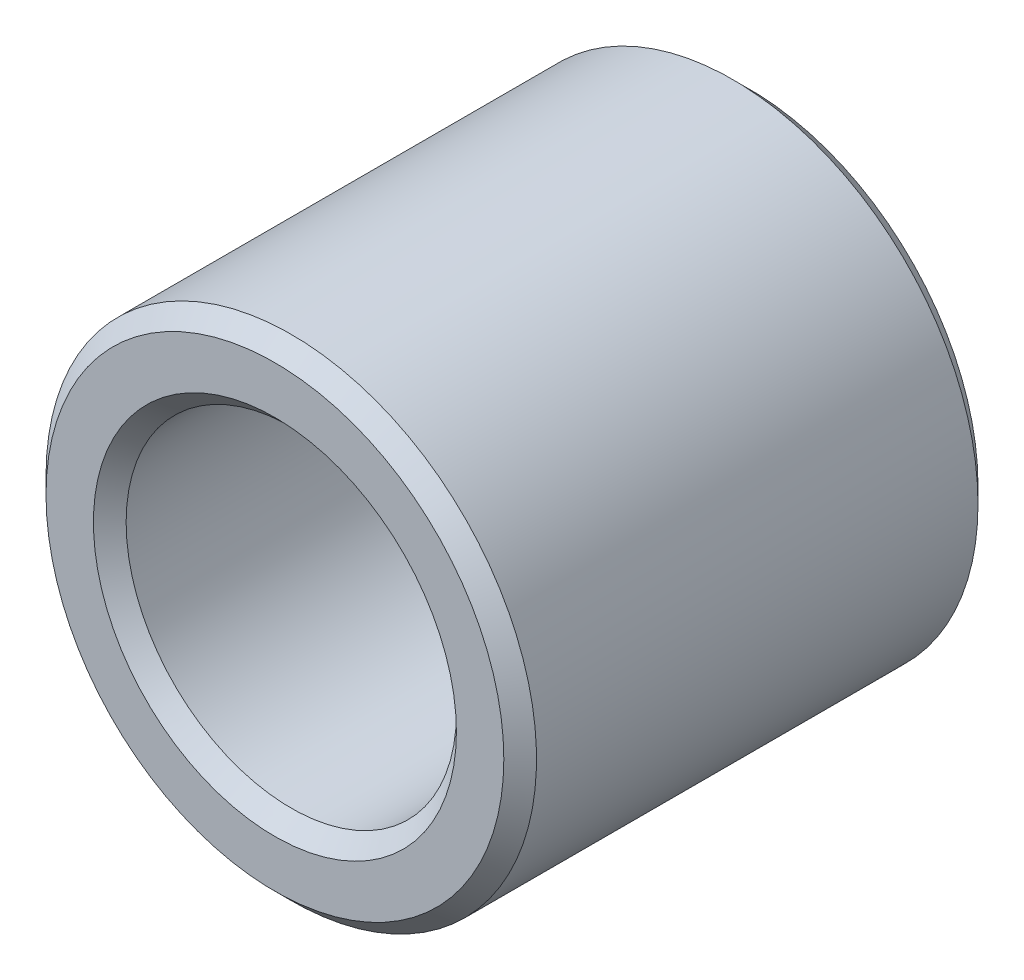
ISO-10303-21;
HEADER;
FILE_DESCRIPTION(('STEP AP214'),'2;1');
FILE_NAME('part.step','',(''),(''),'','','');
FILE_SCHEMA(('AUTOMOTIVE_DESIGN { 1 0 10303 214 1 1 1 1 }'));
ENDSEC;
DATA;
#1=APPLICATION_CONTEXT('core data for automotive mechanical design processes');
#2=APPLICATION_PROTOCOL_DEFINITION('international standard','automotive_design',2000,#1);
#3=PRODUCT_CONTEXT('',#1,'mechanical');
#4=PRODUCT('Part','Part','',(#3));
#5=PRODUCT_RELATED_PRODUCT_CATEGORY('part','',(#4));
#6=PRODUCT_DEFINITION_FORMATION('','',#4);
#7=PRODUCT_DEFINITION_CONTEXT('part definition',#1,'design');
#8=PRODUCT_DEFINITION('design','',#6,#7);
#9=PRODUCT_DEFINITION_SHAPE('','',#8);
#10=(LENGTH_UNIT() NAMED_UNIT(*) SI_UNIT(.MILLI.,.METRE.));
#11=(NAMED_UNIT(*) PLANE_ANGLE_UNIT() SI_UNIT($,.RADIAN.));
#12=(NAMED_UNIT(*) SI_UNIT($,.STERADIAN.) SOLID_ANGLE_UNIT());
#13=UNCERTAINTY_MEASURE_WITH_UNIT(LENGTH_MEASURE(1.E-05),#10,'distance_accuracy_value','');
#14=(GEOMETRIC_REPRESENTATION_CONTEXT(3) GLOBAL_UNCERTAINTY_ASSIGNED_CONTEXT((#13)) GLOBAL_UNIT_ASSIGNED_CONTEXT((#10,
#11,#12)) REPRESENTATION_CONTEXT('',''));
#15=CARTESIAN_POINT('',(0.,0.,0.));
#16=DIRECTION('',(0.,0.,1.));
#17=DIRECTION('',(1.,0.,0.));
#18=AXIS2_PLACEMENT_3D('',#15,#16,#17);
#19=CARTESIAN_POINT('',(0.,0.,7.25));
#20=DIRECTION('',(0.,0.,1.));
#21=DIRECTION('',(1.,0.,0.));
#22=AXIS2_PLACEMENT_3D('',#19,#20,#21);
#23=PLANE('',#22);
#24=CARTESIAN_POINT('',(0.,0.,7.25));
#25=DIRECTION('',(0.,0.,1.));
#26=DIRECTION('',(1.,0.,0.));
#27=AXIS2_PLACEMENT_3D('',#24,#25,#26);
#28=CIRCLE('',#27,5.55000000000001);
#29=CARTESIAN_POINT('',(5.55000000000001,0.,7.25));
#30=VERTEX_POINT('',#29);
#31=EDGE_CURVE('E10',#30,#30,#28,.F.);
#32=ORIENTED_EDGE('',*,*,#31,.T.);
#33=EDGE_LOOP('',(#32));
#34=FACE_BOUND('',#33,.T.);
#35=CARTESIAN_POINT('',(0.,0.,7.25));
#36=DIRECTION('',(0.,0.,1.));
#37=DIRECTION('',(1.,0.,0.));
#38=AXIS2_PLACEMENT_3D('',#35,#36,#37);
#39=CIRCLE('',#38,7.00000000000001);
#40=CARTESIAN_POINT('',(7.00000000000001,0.,7.25));
#41=VERTEX_POINT('',#40);
#42=EDGE_CURVE('E51',#41,#41,#39,.T.);
#43=ORIENTED_EDGE('',*,*,#42,.T.);
#44=EDGE_LOOP('',(#43));
#45=FACE_BOUND('',#44,.T.);
#46=ADVANCED_FACE('F43',(#34,#45),#23,.T.);
#47=CARTESIAN_POINT('',(0.,0.,-7.25));
#48=DIRECTION('',(0.,0.,1.));
#49=DIRECTION('',(1.,0.,0.));
#50=AXIS2_PLACEMENT_3D('',#47,#48,#49);
#51=PLANE('',#50);
#52=CARTESIAN_POINT('',(0.,0.,-7.25));
#53=DIRECTION('',(0.,0.,1.));
#54=DIRECTION('',(1.,0.,0.));
#55=AXIS2_PLACEMENT_3D('',#52,#53,#54);
#56=CIRCLE('',#55,5.54999999999999);
#57=CARTESIAN_POINT('',(5.54999999999999,0.,-7.25));
#58=VERTEX_POINT('',#57);
#59=EDGE_CURVE('E67',#58,#58,#56,.T.);
#60=ORIENTED_EDGE('',*,*,#59,.T.);
#61=EDGE_LOOP('',(#60));
#62=FACE_BOUND('',#61,.T.);
#63=CARTESIAN_POINT('',(0.,0.,-7.25));
#64=DIRECTION('',(0.,0.,1.));
#65=DIRECTION('',(1.,0.,0.));
#66=AXIS2_PLACEMENT_3D('',#63,#64,#65);
#67=CIRCLE('',#66,6.99999999999998);
#68=CARTESIAN_POINT('',(6.99999999999998,0.,-7.25));
#69=VERTEX_POINT('',#68);
#70=EDGE_CURVE('E71',#69,#69,#67,.F.);
#71=ORIENTED_EDGE('',*,*,#70,.T.);
#72=EDGE_LOOP('',(#71));
#73=FACE_BOUND('',#72,.T.);
#74=ADVANCED_FACE('F79',(#62,#73),#51,.F.);
#75=CARTESIAN_POINT('',(0.,0.,7.25));
#76=DIRECTION('',(0.,0.,-1.));
#77=DIRECTION('',(-1.,0.,0.));
#78=AXIS2_PLACEMENT_3D('',#75,#76,#77);
#79=CYLINDRICAL_SURFACE('',#78,7.5);
#80=CARTESIAN_POINT('',(0.,0.,-6.74999999999999));
#81=DIRECTION('',(0.,0.,1.));
#82=DIRECTION('',(1.,0.,0.));
#83=AXIS2_PLACEMENT_3D('',#80,#81,#82);
#84=CIRCLE('',#83,7.5);
#85=CARTESIAN_POINT('',(-7.5,0.,-6.74999999999999));
#86=VERTEX_POINT('',#85);
#87=EDGE_CURVE('E54',#86,#86,#84,.T.);
#88=CARTESIAN_POINT('',(0.,0.,6.75000000000001));
#89=DIRECTION('',(0.,0.,1.));
#90=DIRECTION('',(1.,0.,0.));
#91=AXIS2_PLACEMENT_3D('',#88,#89,#90);
#92=CIRCLE('',#91,7.5);
#93=CARTESIAN_POINT('',(-7.5,0.,6.75000000000001));
#94=VERTEX_POINT('',#93);
#95=EDGE_CURVE('E56',#94,#94,#92,.F.);
#96=CARTESIAN_POINT('',(-7.5,0.,-6.74999999999999));
#97=CARTESIAN_POINT('',(-7.5,0.,-6.60937499999999));
#98=CARTESIAN_POINT('',(-7.5,0.,-6.46874999999999));
#99=CARTESIAN_POINT('',(-7.5,0.,-6.18749999999999));
#100=CARTESIAN_POINT('',(-7.5,0.,-6.04687499999999));
#101=CARTESIAN_POINT('',(-7.5,0.,-5.76562499999999));
#102=CARTESIAN_POINT('',(-7.5,0.,-5.62499999999999));
#103=CARTESIAN_POINT('',(-7.5,0.,-5.34374999999999));
#104=CARTESIAN_POINT('',(-7.5,0.,-5.20312499999999));
#105=CARTESIAN_POINT('',(-7.5,0.,-4.92187499999999));
#106=CARTESIAN_POINT('',(-7.5,0.,-4.78124999999999));
#107=CARTESIAN_POINT('',(-7.5,0.,-4.49999999999999));
#108=CARTESIAN_POINT('',(-7.5,0.,-4.35937499999999));
#109=CARTESIAN_POINT('',(-7.5,0.,-4.07812499999999));
#110=CARTESIAN_POINT('',(-7.5,0.,-3.93749999999999));
#111=CARTESIAN_POINT('',(-7.5,0.,-3.65624999999999));
#112=CARTESIAN_POINT('',(-7.5,0.,-3.51562499999999));
#113=CARTESIAN_POINT('',(-7.5,0.,-3.23437499999999));
#114=CARTESIAN_POINT('',(-7.5,0.,-3.09374999999999));
#115=CARTESIAN_POINT('',(-7.5,0.,-2.81249999999999));
#116=CARTESIAN_POINT('',(-7.5,0.,-2.67187499999999));
#117=CARTESIAN_POINT('',(-7.5,0.,-2.39062499999999));
#118=CARTESIAN_POINT('',(-7.5,0.,-2.24999999999999));
#119=CARTESIAN_POINT('',(-7.5,0.,-1.96874999999999));
#120=CARTESIAN_POINT('',(-7.5,0.,-1.82812499999999));
#121=CARTESIAN_POINT('',(-7.5,0.,-1.54687499999999));
#122=CARTESIAN_POINT('',(-7.5,0.,-1.40624999999999));
#123=CARTESIAN_POINT('',(-7.5,0.,-1.12499999999999));
#124=CARTESIAN_POINT('',(-7.5,0.,-0.984374999999991));
#125=CARTESIAN_POINT('',(-7.5,0.,-0.703124999999991));
#126=CARTESIAN_POINT('',(-7.5,0.,-0.562499999999991));
#127=CARTESIAN_POINT('',(-7.5,0.,-0.281249999999992));
#128=CARTESIAN_POINT('',(-7.5,0.,-0.140624999999991));
#129=CARTESIAN_POINT('',(-7.5,0.,0.140625000000009));
#130=CARTESIAN_POINT('',(-7.5,0.,0.281250000000009));
#131=CARTESIAN_POINT('',(-7.5,0.,0.562500000000009));
#132=CARTESIAN_POINT('',(-7.5,0.,0.703125000000009));
#133=CARTESIAN_POINT('',(-7.5,0.,0.984375000000008));
#134=CARTESIAN_POINT('',(-7.5,0.,1.12500000000001));
#135=CARTESIAN_POINT('',(-7.5,0.,1.40625000000001));
#136=CARTESIAN_POINT('',(-7.5,0.,1.54687500000001));
#137=CARTESIAN_POINT('',(-7.5,0.,1.82812500000001));
#138=CARTESIAN_POINT('',(-7.5,0.,1.96875000000001));
#139=CARTESIAN_POINT('',(-7.5,0.,2.25000000000001));
#140=CARTESIAN_POINT('',(-7.5,0.,2.39062500000001));
#141=CARTESIAN_POINT('',(-7.5,0.,2.67187500000001));
#142=CARTESIAN_POINT('',(-7.5,0.,2.81250000000001));
#143=CARTESIAN_POINT('',(-7.5,0.,3.09375000000001));
#144=CARTESIAN_POINT('',(-7.5,0.,3.23437500000001));
#145=CARTESIAN_POINT('',(-7.5,0.,3.51562500000001));
#146=CARTESIAN_POINT('',(-7.5,0.,3.65625000000001));
#147=CARTESIAN_POINT('',(-7.5,0.,3.93750000000001));
#148=CARTESIAN_POINT('',(-7.5,0.,4.07812500000001));
#149=CARTESIAN_POINT('',(-7.5,0.,4.35937500000001));
#150=CARTESIAN_POINT('',(-7.5,0.,4.50000000000001));
#151=CARTESIAN_POINT('',(-7.5,0.,4.78125000000001));
#152=CARTESIAN_POINT('',(-7.5,0.,4.92187500000001));
#153=CARTESIAN_POINT('',(-7.5,0.,5.20312500000001));
#154=CARTESIAN_POINT('',(-7.5,0.,5.34375000000001));
#155=CARTESIAN_POINT('',(-7.5,0.,5.62500000000001));
#156=CARTESIAN_POINT('',(-7.5,0.,5.76562500000001));
#157=CARTESIAN_POINT('',(-7.5,0.,6.04687500000001));
#158=CARTESIAN_POINT('',(-7.5,0.,6.18750000000001));
#159=CARTESIAN_POINT('',(-7.5,0.,6.46875000000001));
#160=CARTESIAN_POINT('',(-7.5,0.,6.60937500000001));
#161=CARTESIAN_POINT('',(-7.5,0.,6.75000000000001));
#162=B_SPLINE_CURVE_WITH_KNOTS('',3,(#96,#97,#98,#99,#100,#101,#102,#103,#104,#105,#106,#107,
#108,#109,#110,#111,#112,#113,#114,#115,#116,#117,#118,#119,#120,#121,#122,#123,#124,#125,#126,
#127,#128,#129,#130,#131,#132,#133,#134,#135,#136,#137,#138,#139,#140,#141,#142,#143,#144,#145,
#146,#147,#148,#149,#150,#151,#152,#153,#154,#155,#156,#157,#158,#159,#160,#161),.UNSPECIFIED.,
.F.,.F.,(4,2,2,2,2,2,2,2,2,2,2,2,2,2,2,2,2,2,2,2,2,2,2,2,2,2,2,2,2,2,2,2,4),(0.,0.421875,
0.843750000000001,1.265625,1.6875,2.109375,2.53125,2.953125,3.375,3.796875,4.21875,4.640625,
5.0625,5.484375,5.90625,6.328125,6.75,7.171875,7.59375,8.015625,8.4375,8.859375,9.28125,
9.703125,10.125,10.546875,10.96875,11.390625,11.8125,12.234375,12.65625,13.078125,13.5),.UNSPECIFIED.);
#163=EDGE_CURVE('BSEAM87',#86,#94,#162,.T.);
#164=ORIENTED_EDGE('',*,*,#87,.T.);
#165=ORIENTED_EDGE('',*,*,#95,.T.);
#166=ORIENTED_EDGE('',*,*,#163,.T.);
#167=ORIENTED_EDGE('',*,*,#163,.F.);
#168=EDGE_LOOP('',(#164,#166,#165,#167));
#169=FACE_BOUND('',#168,.T.);
#170=ADVANCED_FACE('F87',(#169),#79,.T.);
#171=CARTESIAN_POINT('',(0.,0.,7.25));
#172=DIRECTION('',(0.,0.,-1.));
#173=DIRECTION('',(-1.,0.,0.));
#174=AXIS2_PLACEMENT_3D('',#171,#172,#173);
#175=CYLINDRICAL_SURFACE('',#174,5.05);
#176=CARTESIAN_POINT('',(0.,0.,-6.75000000000001));
#177=DIRECTION('',(0.,0.,1.));
#178=DIRECTION('',(1.,0.,0.));
#179=AXIS2_PLACEMENT_3D('',#176,#177,#178);
#180=CIRCLE('',#179,5.05);
#181=CARTESIAN_POINT('',(-5.05,0.,-6.75000000000001));
#182=VERTEX_POINT('',#181);
#183=EDGE_CURVE('E65',#182,#182,#180,.F.);
#184=CARTESIAN_POINT('',(0.,0.,6.74999999999999));
#185=DIRECTION('',(0.,0.,1.));
#186=DIRECTION('',(1.,0.,0.));
#187=AXIS2_PLACEMENT_3D('',#184,#185,#186);
#188=CIRCLE('',#187,5.05);
#189=CARTESIAN_POINT('',(-5.05,0.,6.74999999999999));
#190=VERTEX_POINT('',#189);
#191=EDGE_CURVE('E70',#190,#190,#188,.T.);
#192=CARTESIAN_POINT('',(-5.05,0.,-6.75000000000001));
#193=CARTESIAN_POINT('',(-5.05,0.,-6.60937500000001));
#194=CARTESIAN_POINT('',(-5.05,0.,-6.46875000000001));
#195=CARTESIAN_POINT('',(-5.05,0.,-6.18750000000001));
#196=CARTESIAN_POINT('',(-5.05,0.,-6.04687500000001));
#197=CARTESIAN_POINT('',(-5.05,0.,-5.76562500000001));
#198=CARTESIAN_POINT('',(-5.05,0.,-5.62500000000001));
#199=CARTESIAN_POINT('',(-5.05,0.,-5.34375000000001));
#200=CARTESIAN_POINT('',(-5.05,0.,-5.20312500000001));
#201=CARTESIAN_POINT('',(-5.05,0.,-4.92187500000001));
#202=CARTESIAN_POINT('',(-5.05,0.,-4.78125000000001));
#203=CARTESIAN_POINT('',(-5.05,0.,-4.50000000000001));
#204=CARTESIAN_POINT('',(-5.05,0.,-4.35937500000001));
#205=CARTESIAN_POINT('',(-5.05,0.,-4.07812500000001));
#206=CARTESIAN_POINT('',(-5.05,0.,-3.93750000000001));
#207=CARTESIAN_POINT('',(-5.05,0.,-3.65625000000001));
#208=CARTESIAN_POINT('',(-5.05,0.,-3.51562500000001));
#209=CARTESIAN_POINT('',(-5.05,0.,-3.23437500000001));
#210=CARTESIAN_POINT('',(-5.05,0.,-3.09375000000001));
#211=CARTESIAN_POINT('',(-5.05,0.,-2.81250000000001));
#212=CARTESIAN_POINT('',(-5.05,0.,-2.67187500000001));
#213=CARTESIAN_POINT('',(-5.05,0.,-2.39062500000001));
#214=CARTESIAN_POINT('',(-5.05,0.,-2.25000000000001));
#215=CARTESIAN_POINT('',(-5.05,0.,-1.96875000000001));
#216=CARTESIAN_POINT('',(-5.05,0.,-1.82812500000001));
#217=CARTESIAN_POINT('',(-5.05,0.,-1.54687500000001));
#218=CARTESIAN_POINT('',(-5.05,0.,-1.40625000000001));
#219=CARTESIAN_POINT('',(-5.05,0.,-1.12500000000001));
#220=CARTESIAN_POINT('',(-5.05,0.,-0.984375000000007));
#221=CARTESIAN_POINT('',(-5.05,0.,-0.703125000000007));
#222=CARTESIAN_POINT('',(-5.05,0.,-0.562500000000008));
#223=CARTESIAN_POINT('',(-5.05,0.,-0.281250000000008));
#224=CARTESIAN_POINT('',(-5.05,0.,-0.140625000000008));
#225=CARTESIAN_POINT('',(-5.05,0.,0.140624999999992));
#226=CARTESIAN_POINT('',(-5.05,0.,0.281249999999992));
#227=CARTESIAN_POINT('',(-5.05,0.,0.562499999999992));
#228=CARTESIAN_POINT('',(-5.05,0.,0.703124999999992));
#229=CARTESIAN_POINT('',(-5.05,0.,0.984374999999992));
#230=CARTESIAN_POINT('',(-5.05,0.,1.12499999999999));
#231=CARTESIAN_POINT('',(-5.05,0.,1.40624999999999));
#232=CARTESIAN_POINT('',(-5.05,0.,1.54687499999999));
#233=CARTESIAN_POINT('',(-5.05,0.,1.82812499999999));
#234=CARTESIAN_POINT('',(-5.05,0.,1.96874999999999));
#235=CARTESIAN_POINT('',(-5.05,0.,2.24999999999999));
#236=CARTESIAN_POINT('',(-5.05,0.,2.39062499999999));
#237=CARTESIAN_POINT('',(-5.05,0.,2.67187499999999));
#238=CARTESIAN_POINT('',(-5.05,0.,2.81249999999999));
#239=CARTESIAN_POINT('',(-5.05,0.,3.09374999999999));
#240=CARTESIAN_POINT('',(-5.05,0.,3.23437499999999));
#241=CARTESIAN_POINT('',(-5.05,0.,3.51562499999999));
#242=CARTESIAN_POINT('',(-5.05,0.,3.65624999999999));
#243=CARTESIAN_POINT('',(-5.05,0.,3.93749999999999));
#244=CARTESIAN_POINT('',(-5.05,0.,4.07812499999999));
#245=CARTESIAN_POINT('',(-5.05,0.,4.35937499999999));
#246=CARTESIAN_POINT('',(-5.05,0.,4.49999999999999));
#247=CARTESIAN_POINT('',(-5.05,0.,4.78124999999999));
#248=CARTESIAN_POINT('',(-5.05,0.,4.92187499999999));
#249=CARTESIAN_POINT('',(-5.05,0.,5.20312499999999));
#250=CARTESIAN_POINT('',(-5.05,0.,5.34374999999999));
#251=CARTESIAN_POINT('',(-5.05,0.,5.62499999999999));
#252=CARTESIAN_POINT('',(-5.05,0.,5.76562499999999));
#253=CARTESIAN_POINT('',(-5.05,0.,6.04687499999999));
#254=CARTESIAN_POINT('',(-5.05,0.,6.18749999999999));
#255=CARTESIAN_POINT('',(-5.05,0.,6.46874999999999));
#256=CARTESIAN_POINT('',(-5.05,0.,6.60937499999999));
#257=CARTESIAN_POINT('',(-5.05,0.,6.74999999999999));
#258=B_SPLINE_CURVE_WITH_KNOTS('',3,(#192,#193,#194,#195,#196,#197,#198,#199,#200,#201,#202,
#203,#204,#205,#206,#207,#208,#209,#210,#211,#212,#213,#214,#215,#216,#217,#218,#219,#220,#221,
#222,#223,#224,#225,#226,#227,#228,#229,#230,#231,#232,#233,#234,#235,#236,#237,#238,#239,#240,
#241,#242,#243,#244,#245,#246,#247,#248,#249,#250,#251,#252,#253,#254,#255,#256,#257),
.UNSPECIFIED.,.F.,.F.,(4,2,2,2,2,2,2,2,2,2,2,2,2,2,2,2,2,2,2,2,2,2,2,2,2,2,2,2,2,2,2,2,4),(0.,
0.421875,0.843750000000001,1.265625,1.6875,2.109375,2.53125,2.953125,3.375,3.796875,4.21875,
4.640625,5.0625,5.484375,5.90625,6.328125,6.75,7.171875,7.59375,8.015625,8.4375,8.859375,
9.28125,9.703125,10.125,10.546875,10.96875,11.390625,11.8125,12.234375,12.65625,13.078125,13.5),.UNSPECIFIED.);
#259=EDGE_CURVE('BSEAM89',#182,#190,#258,.T.);
#260=ORIENTED_EDGE('',*,*,#183,.T.);
#261=ORIENTED_EDGE('',*,*,#191,.T.);
#262=ORIENTED_EDGE('',*,*,#259,.T.);
#263=ORIENTED_EDGE('',*,*,#259,.F.);
#264=EDGE_LOOP('',(#260,#262,#261,#263));
#265=FACE_BOUND('',#264,.T.);
#266=ADVANCED_FACE('F89',(#265),#175,.F.);
#267=CARTESIAN_POINT('',(0.,0.,-7.25));
#268=DIRECTION('',(0.,0.,-1.));
#269=DIRECTION('',(-1.,0.,0.));
#270=AXIS2_PLACEMENT_3D('',#267,#268,#269);
#271=CONICAL_SURFACE('',#270,5.54999999999999,0.785398163397445);
#272=ORIENTED_EDGE('',*,*,#183,.F.);
#273=EDGE_LOOP('',(#272));
#274=FACE_BOUND('',#273,.T.);
#275=ORIENTED_EDGE('',*,*,#59,.F.);
#276=EDGE_LOOP('',(#275));
#277=FACE_BOUND('',#276,.T.);
#278=ADVANCED_FACE('F81',(#274,#277),#271,.F.);
#279=CARTESIAN_POINT('',(0.,0.,-6.74999999999999));
#280=DIRECTION('',(0.,0.,1.));
#281=DIRECTION('',(1.,0.,0.));
#282=AXIS2_PLACEMENT_3D('',#279,#280,#281);
#283=CONICAL_SURFACE('',#282,7.5,0.785398163397451);
#284=ORIENTED_EDGE('',*,*,#70,.F.);
#285=EDGE_LOOP('',(#284));
#286=FACE_BOUND('',#285,.T.);
#287=ORIENTED_EDGE('',*,*,#87,.F.);
#288=EDGE_LOOP('',(#287));
#289=FACE_BOUND('',#288,.T.);
#290=ADVANCED_FACE('F80',(#286,#289),#283,.T.);
#291=CARTESIAN_POINT('',(0.,0.,6.74999999999999));
#292=DIRECTION('',(0.,0.,1.));
#293=DIRECTION('',(1.,0.,0.));
#294=AXIS2_PLACEMENT_3D('',#291,#292,#293);
#295=CONICAL_SURFACE('',#294,5.05,0.785398163397452);
#296=ORIENTED_EDGE('',*,*,#31,.F.);
#297=EDGE_LOOP('',(#296));
#298=FACE_BOUND('',#297,.T.);
#299=ORIENTED_EDGE('',*,*,#191,.F.);
#300=EDGE_LOOP('',(#299));
#301=FACE_BOUND('',#300,.T.);
#302=ADVANCED_FACE('F85',(#298,#301),#295,.F.);
#303=CARTESIAN_POINT('',(0.,0.,7.25));
#304=DIRECTION('',(0.,0.,-1.));
#305=DIRECTION('',(-1.,0.,0.));
#306=AXIS2_PLACEMENT_3D('',#303,#304,#305);
#307=CONICAL_SURFACE('',#306,7.00000000000001,0.785398163397443);
#308=ORIENTED_EDGE('',*,*,#95,.F.);
#309=EDGE_LOOP('',(#308));
#310=FACE_BOUND('',#309,.T.);
#311=ORIENTED_EDGE('',*,*,#42,.F.);
#312=EDGE_LOOP('',(#311));
#313=FACE_BOUND('',#312,.T.);
#314=ADVANCED_FACE('F46',(#310,#313),#307,.T.);
#315=CLOSED_SHELL('',(#46,#74,#170,#266,#278,#290,#302,#314));
#316=MANIFOLD_SOLID_BREP('B2',#315);
#317=ADVANCED_BREP_SHAPE_REPRESENTATION('',(#18,#316),#14);
#318=SHAPE_DEFINITION_REPRESENTATION(#9,#317);
ENDSEC;
END-ISO-10303-21;
